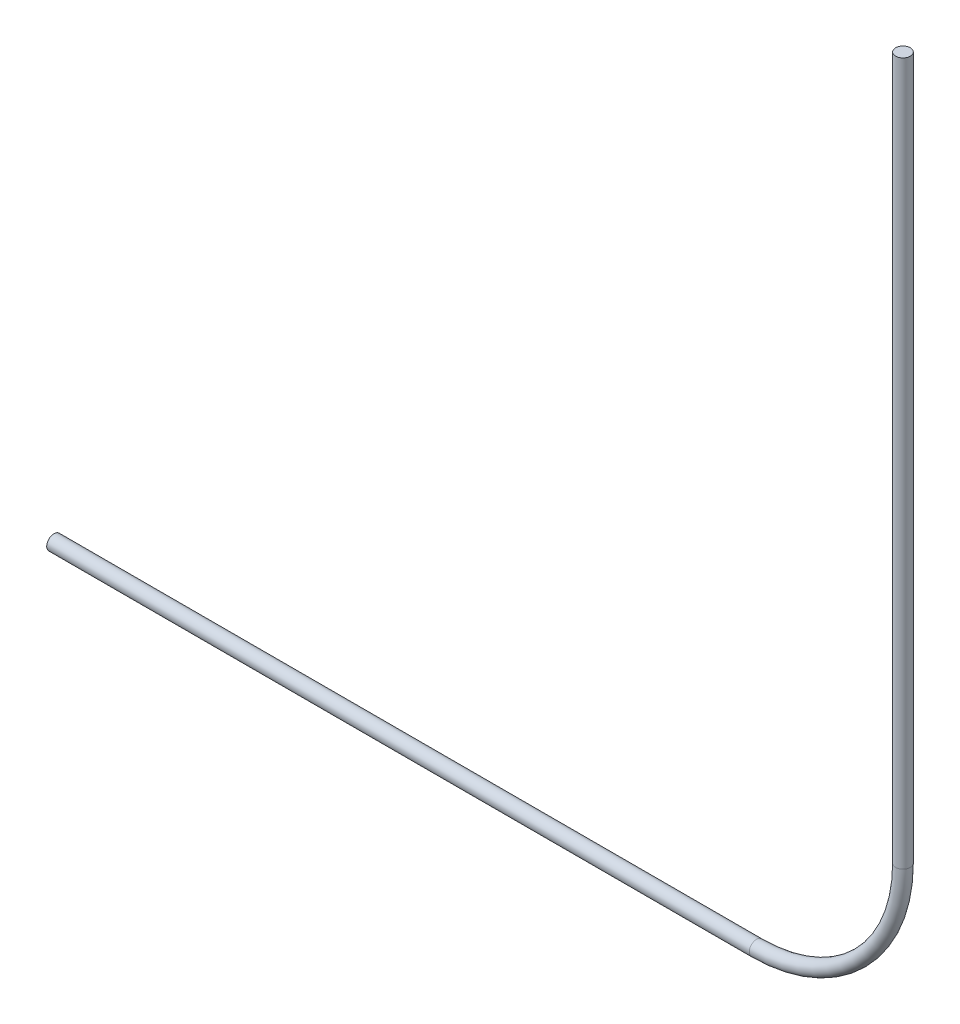
ISO-10303-21;
HEADER;
FILE_DESCRIPTION(('STEP AP214'),'2;1');
FILE_NAME('part.step','',(''),(''),'','','');
FILE_SCHEMA(('AUTOMOTIVE_DESIGN { 1 0 10303 214 1 1 1 1 }'));
ENDSEC;
DATA;
#1=APPLICATION_CONTEXT('core data for automotive mechanical design processes');
#2=APPLICATION_PROTOCOL_DEFINITION('international standard','automotive_design',2000,#1);
#3=PRODUCT_CONTEXT('',#1,'mechanical');
#4=PRODUCT('Part','Part','',(#3));
#5=PRODUCT_RELATED_PRODUCT_CATEGORY('part','',(#4));
#6=PRODUCT_DEFINITION_FORMATION('','',#4);
#7=PRODUCT_DEFINITION_CONTEXT('part definition',#1,'design');
#8=PRODUCT_DEFINITION('design','',#6,#7);
#9=PRODUCT_DEFINITION_SHAPE('','',#8);
#10=(LENGTH_UNIT() NAMED_UNIT(*) SI_UNIT(.MILLI.,.METRE.));
#11=(NAMED_UNIT(*) PLANE_ANGLE_UNIT() SI_UNIT($,.RADIAN.));
#12=(NAMED_UNIT(*) SI_UNIT($,.STERADIAN.) SOLID_ANGLE_UNIT());
#13=UNCERTAINTY_MEASURE_WITH_UNIT(LENGTH_MEASURE(1.E-05),#10,'distance_accuracy_value','');
#14=(GEOMETRIC_REPRESENTATION_CONTEXT(3) GLOBAL_UNCERTAINTY_ASSIGNED_CONTEXT((#13)) GLOBAL_UNIT_ASSIGNED_CONTEXT((#10,
#11,#12)) REPRESENTATION_CONTEXT('',''));
#15=CARTESIAN_POINT('',(0.,0.,0.));
#16=DIRECTION('',(0.,0.,1.));
#17=DIRECTION('',(1.,0.,0.));
#18=AXIS2_PLACEMENT_3D('',#15,#16,#17);
#19=CARTESIAN_POINT('',(0.,736.6,0.));
#20=DIRECTION('',(0.,1.,0.));
#21=DIRECTION('',(-1.,0.,0.));
#22=AXIS2_PLACEMENT_3D('',#19,#20,#21);
#23=PLANE('',#22);
#24=CARTESIAN_POINT('',(0.,736.6,0.));
#25=DIRECTION('',(0.,1.,0.));
#26=DIRECTION('',(-1.,0.,0.));
#27=AXIS2_PLACEMENT_3D('',#24,#25,#26);
#28=CIRCLE('',#27,6.35);
#29=CARTESIAN_POINT('',(-6.35,736.6,0.));
#30=VERTEX_POINT('',#29);
#31=EDGE_CURVE('E60',#30,#30,#28,.T.);
#32=ORIENTED_EDGE('',*,*,#31,.T.);
#33=EDGE_LOOP('',(#32));
#34=FACE_BOUND('',#33,.T.);
#35=ADVANCED_FACE('F46',(#34),#23,.T.);
#36=CARTESIAN_POINT('',(-736.6,0.,0.));
#37=DIRECTION('',(1.,0.,0.));
#38=DIRECTION('',(0.,1.,0.));
#39=AXIS2_PLACEMENT_3D('',#36,#37,#38);
#40=PLANE('',#39);
#41=CARTESIAN_POINT('',(-736.6,0.,0.));
#42=DIRECTION('',(1.,0.,0.));
#43=DIRECTION('',(0.,1.,0.));
#44=AXIS2_PLACEMENT_3D('',#41,#42,#43);
#45=CIRCLE('',#44,6.35);
#46=CARTESIAN_POINT('',(-736.6,6.34999999999993,0.));
#47=VERTEX_POINT('',#46);
#48=EDGE_CURVE('E11',#47,#47,#45,.T.);
#49=ORIENTED_EDGE('',*,*,#48,.F.);
#50=EDGE_LOOP('',(#49));
#51=FACE_BOUND('',#50,.T.);
#52=ADVANCED_FACE('F70',(#51),#40,.F.);
#53=CARTESIAN_POINT('',(0.,736.6,0.));
#54=DIRECTION('',(0.,-1.,0.));
#55=DIRECTION('',(0.,0.,-1.));
#56=AXIS2_PLACEMENT_3D('',#53,#54,#55);
#57=CYLINDRICAL_SURFACE('',#56,6.35);
#58=CARTESIAN_POINT('',(0.,127.000000000001,0.));
#59=DIRECTION('',(0.,1.,0.));
#60=DIRECTION('',(-1.,0.,0.));
#61=AXIS2_PLACEMENT_3D('',#58,#59,#60);
#62=CIRCLE('',#61,6.35);
#63=CARTESIAN_POINT('',(6.34999999999999,127.000000000001,0.));
#64=VERTEX_POINT('',#63);
#65=EDGE_CURVE('E56',#64,#64,#62,.T.);
#66=ORIENTED_EDGE('',*,*,#65,.T.);
#67=EDGE_LOOP('',(#66));
#68=FACE_BOUND('',#67,.T.);
#69=ORIENTED_EDGE('',*,*,#31,.F.);
#70=EDGE_LOOP('',(#69));
#71=FACE_BOUND('',#70,.T.);
#72=ADVANCED_FACE('F67',(#68,#71),#57,.T.);
#73=CARTESIAN_POINT('',(-127.,127.,0.));
#74=DIRECTION('',(0.,0.,-1.));
#75=DIRECTION('',(-1.,0.,0.));
#76=AXIS2_PLACEMENT_3D('',#73,#74,#75);
#77=TOROIDAL_SURFACE('',#76,127.,6.35);
#78=CARTESIAN_POINT('',(-127.000000000001,-5.24164231748592E-12,0.));
#79=DIRECTION('',(1.,0.,0.));
#80=DIRECTION('',(0.,1.,0.));
#81=AXIS2_PLACEMENT_3D('',#78,#79,#80);
#82=CIRCLE('',#81,6.35);
#83=CARTESIAN_POINT('',(-127.000000000001,-6.34999999999999,0.));
#84=VERTEX_POINT('',#83);
#85=EDGE_CURVE('E52',#84,#84,#82,.T.);
#86=CARTESIAN_POINT('',(-127.,127.,0.));
#87=DIRECTION('',(0.,0.,-1.));
#88=DIRECTION('',(-1.,0.,0.));
#89=AXIS2_PLACEMENT_3D('',#86,#87,#88);
#90=CIRCLE('',#89,133.35);
#91=EDGE_CURVE('',#64,#84,#90,.T.);
#92=ORIENTED_EDGE('',*,*,#65,.F.);
#93=ORIENTED_EDGE('',*,*,#85,.T.);
#94=ORIENTED_EDGE('',*,*,#91,.T.);
#95=ORIENTED_EDGE('',*,*,#91,.F.);
#96=EDGE_LOOP('',(#92,#94,#93,#95));
#97=FACE_BOUND('',#96,.T.);
#98=ADVANCED_FACE('F69',(#97),#77,.T.);
#99=CARTESIAN_POINT('',(-127.000000000001,0.,0.));
#100=DIRECTION('',(-1.,0.,0.));
#101=DIRECTION('',(0.,-1.,0.));
#102=AXIS2_PLACEMENT_3D('',#99,#100,#101);
#103=CYLINDRICAL_SURFACE('',#102,6.35);
#104=ORIENTED_EDGE('',*,*,#48,.T.);
#105=EDGE_LOOP('',(#104));
#106=FACE_BOUND('',#105,.T.);
#107=ORIENTED_EDGE('',*,*,#85,.F.);
#108=EDGE_LOOP('',(#107));
#109=FACE_BOUND('',#108,.T.);
#110=ADVANCED_FACE('F77',(#106,#109),#103,.T.);
#111=CLOSED_SHELL('',(#35,#52,#72,#98,#110));
#112=MANIFOLD_SOLID_BREP('B2',#111);
#113=ADVANCED_BREP_SHAPE_REPRESENTATION('',(#18,#112),#14);
#114=SHAPE_DEFINITION_REPRESENTATION(#9,#113);
ENDSEC;
END-ISO-10303-21;
